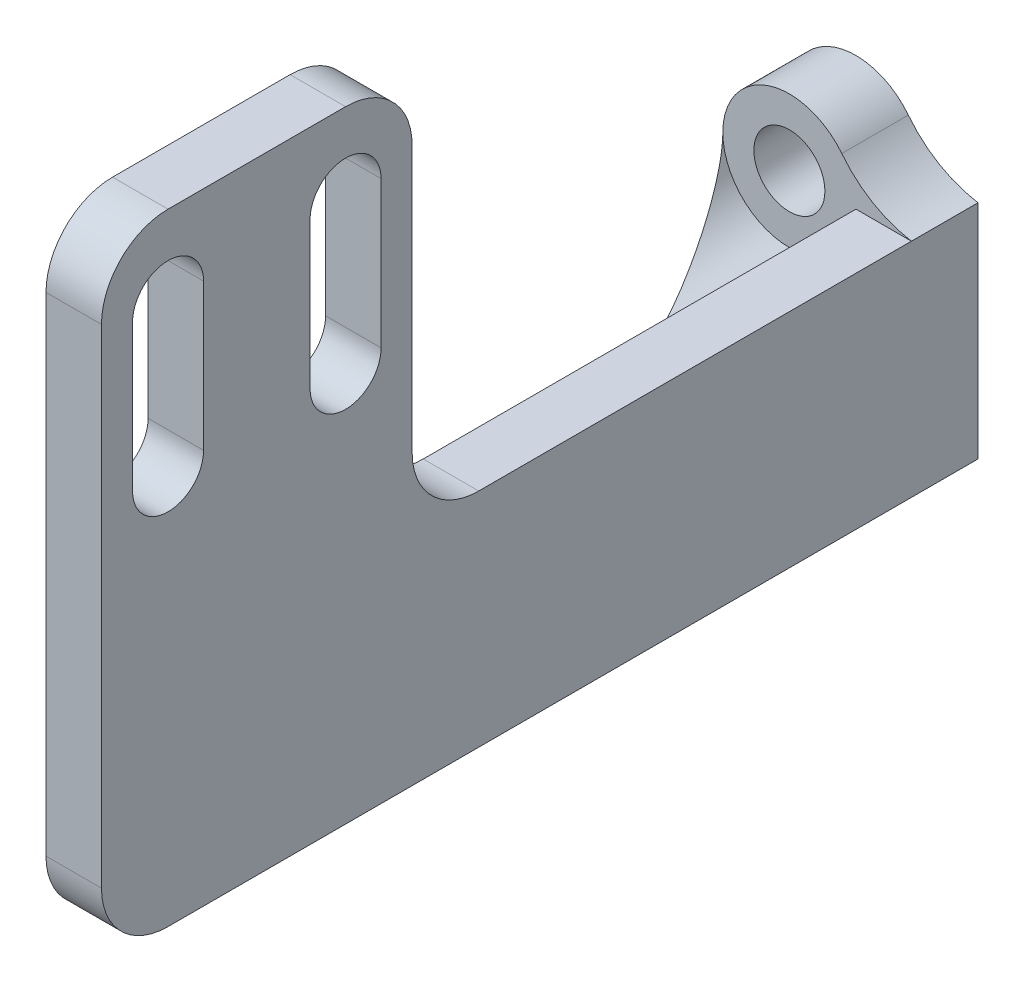
ISO-10303-21;
HEADER;
FILE_DESCRIPTION(('STEP AP214'),'2;1');
FILE_NAME('part.step','',(''),(''),'','','');
FILE_SCHEMA(('AUTOMOTIVE_DESIGN { 1 0 10303 214 1 1 1 1 }'));
ENDSEC;
DATA;
#1=APPLICATION_CONTEXT('core data for automotive mechanical design processes');
#2=APPLICATION_PROTOCOL_DEFINITION('international standard','automotive_design',2000,#1);
#3=PRODUCT_CONTEXT('',#1,'mechanical');
#4=PRODUCT('Part','Part','',(#3));
#5=PRODUCT_RELATED_PRODUCT_CATEGORY('part','',(#4));
#6=PRODUCT_DEFINITION_FORMATION('','',#4);
#7=PRODUCT_DEFINITION_CONTEXT('part definition',#1,'design');
#8=PRODUCT_DEFINITION('design','',#6,#7);
#9=PRODUCT_DEFINITION_SHAPE('','',#8);
#10=(LENGTH_UNIT() NAMED_UNIT(*) SI_UNIT(.MILLI.,.METRE.));
#11=(NAMED_UNIT(*) PLANE_ANGLE_UNIT() SI_UNIT($,.RADIAN.));
#12=(NAMED_UNIT(*) SI_UNIT($,.STERADIAN.) SOLID_ANGLE_UNIT());
#13=UNCERTAINTY_MEASURE_WITH_UNIT(LENGTH_MEASURE(1.E-05),#10,'distance_accuracy_value','');
#14=(GEOMETRIC_REPRESENTATION_CONTEXT(3) GLOBAL_UNCERTAINTY_ASSIGNED_CONTEXT((#13)) GLOBAL_UNIT_ASSIGNED_CONTEXT((#10,
#11,#12)) REPRESENTATION_CONTEXT('',''));
#15=CARTESIAN_POINT('',(0.,0.,0.));
#16=DIRECTION('',(0.,0.,1.));
#17=DIRECTION('',(1.,0.,0.));
#18=AXIS2_PLACEMENT_3D('',#15,#16,#17);
#19=CARTESIAN_POINT('',(3.00000000000005,-33.0103407456897,3.));
#20=DIRECTION('',(0.,1.,0.));
#21=DIRECTION('',(0.,0.,1.));
#22=AXIS2_PLACEMENT_3D('',#19,#20,#21);
#23=PLANE('',#22);
#24=DIRECTION('',(0.,0.,-1.));
#25=VECTOR('',#24,1.);
#26=CARTESIAN_POINT('',(3.00000000000005,-33.0103407456897,39.5));
#27=LINE('',#26,#25);
#28=CARTESIAN_POINT('',(3.00000000000005,-33.0103407456897,22.5));
#29=VERTEX_POINT('',#28);
#30=CARTESIAN_POINT('',(3.00000000000004,-33.0103407456897,14.));
#31=VERTEX_POINT('',#30);
#32=EDGE_CURVE('E345',#29,#31,#27,.T.);
#33=ORIENTED_EDGE('',*,*,#32,.F.);
#34=DIRECTION('',(1.,0.,0.));
#35=VECTOR('',#34,1.);
#36=CARTESIAN_POINT('',(5.50000000000005,-33.0103407456897,22.5));
#37=LINE('',#36,#35);
#38=CARTESIAN_POINT('',(5.50000000000005,-33.0103407456897,22.5));
#39=VERTEX_POINT('',#38);
#40=EDGE_CURVE('E313',#29,#39,#37,.T.);
#41=ORIENTED_EDGE('',*,*,#40,.T.);
#42=DIRECTION('',(0.,0.,-1.));
#43=VECTOR('',#42,1.);
#44=CARTESIAN_POINT('',(5.50000000000005,-33.0103407456897,3.));
#45=LINE('',#44,#43);
#46=CARTESIAN_POINT('',(5.50000000000005,-33.0103407456897,3.));
#47=VERTEX_POINT('',#46);
#48=EDGE_CURVE('E255',#39,#47,#45,.T.);
#49=ORIENTED_EDGE('',*,*,#48,.T.);
#50=DIRECTION('',(-1.,0.,0.));
#51=VECTOR('',#50,1.);
#52=CARTESIAN_POINT('',(0.,-33.0103407456897,3.));
#53=LINE('',#52,#51);
#54=CARTESIAN_POINT('',(3.00000000000004,-33.0103407456897,3.));
#55=VERTEX_POINT('',#54);
#56=EDGE_CURVE('E247',#47,#55,#53,.T.);
#57=ORIENTED_EDGE('',*,*,#56,.T.);
#58=DIRECTION('',(0.,0.,-1.));
#59=VECTOR('',#58,1.);
#60=CARTESIAN_POINT('',(3.00000000000004,-33.0103407456897,39.5));
#61=LINE('',#60,#59);
#62=EDGE_CURVE('E229',#55,#31,#61,.F.);
#63=ORIENTED_EDGE('',*,*,#62,.T.);
#64=EDGE_LOOP('',(#33,#41,#49,#57,#63));
#65=FACE_BOUND('',#64,.T.);
#66=ADVANCED_FACE('F67',(#65),#23,.T.);
#67=CARTESIAN_POINT('',(5.50000000000005,-43.0103407456897,3.));
#68=DIRECTION('',(0.,-1.,0.));
#69=DIRECTION('',(0.,0.,-1.));
#70=AXIS2_PLACEMENT_3D('',#67,#68,#69);
#71=PLANE('',#70);
#72=DIRECTION('',(0.,0.,-1.));
#73=VECTOR('',#72,1.);
#74=CARTESIAN_POINT('',(5.50000000000005,-43.0103407456897,3.));
#75=LINE('',#74,#73);
#76=CARTESIAN_POINT('',(5.50000000000005,-43.0103407456897,36.5));
#77=VERTEX_POINT('',#76);
#78=CARTESIAN_POINT('',(5.50000000000005,-43.0103407456897,3.));
#79=VERTEX_POINT('',#78);
#80=EDGE_CURVE('E396',#77,#79,#75,.T.);
#81=ORIENTED_EDGE('',*,*,#80,.F.);
#82=DIRECTION('',(1.,0.,0.));
#83=VECTOR('',#82,1.);
#84=CARTESIAN_POINT('',(5.50000000000005,-43.0103407456897,36.5));
#85=LINE('',#84,#83);
#86=CARTESIAN_POINT('',(3.00000000000005,-43.0103407456897,36.5));
#87=VERTEX_POINT('',#86);
#88=EDGE_CURVE('E306',#77,#87,#85,.F.);
#89=ORIENTED_EDGE('',*,*,#88,.T.);
#90=DIRECTION('',(0.,0.,-1.));
#91=VECTOR('',#90,1.);
#92=CARTESIAN_POINT('',(3.00000000000005,-43.0103407456897,39.5));
#93=LINE('',#92,#91);
#94=CARTESIAN_POINT('',(3.00000000000005,-43.0103407456897,14.));
#95=VERTEX_POINT('',#94);
#96=EDGE_CURVE('E347',#87,#95,#93,.T.);
#97=ORIENTED_EDGE('',*,*,#96,.T.);
#98=DIRECTION('',(0.,0.,-1.));
#99=VECTOR('',#98,1.);
#100=CARTESIAN_POINT('',(3.00000000000005,-43.0103407456897,39.5));
#101=LINE('',#100,#99);
#102=CARTESIAN_POINT('',(3.00000000000005,-43.0103407456897,3.));
#103=VERTEX_POINT('',#102);
#104=EDGE_CURVE('E239',#95,#103,#101,.T.);
#105=ORIENTED_EDGE('',*,*,#104,.T.);
#106=DIRECTION('',(1.,0.,0.));
#107=VECTOR('',#106,1.);
#108=CARTESIAN_POINT('',(0.,-43.0103407456897,3.));
#109=LINE('',#108,#107);
#110=EDGE_CURVE('E390',#103,#79,#109,.T.);
#111=ORIENTED_EDGE('',*,*,#110,.T.);
#112=EDGE_LOOP('',(#81,#89,#97,#105,#111));
#113=FACE_BOUND('',#112,.T.);
#114=ADVANCED_FACE('F451',(#113),#71,.T.);
#115=CARTESIAN_POINT('',(3.00000000000005,-20.480376659548,14.));
#116=DIRECTION('',(-0.877895572914384,0.,0.478852130680573));
#117=DIRECTION('',(0.478852130680573,0.,0.877895572914384));
#118=AXIS2_PLACEMENT_3D('',#115,#116,#117);
#119=PLANE('',#118);
#120=DIRECTION('',(0.,-1.,0.));
#121=VECTOR('',#120,1.);
#122=CARTESIAN_POINT('',(-2.99999999999995,0.,3.));
#123=LINE('',#122,#121);
#124=CARTESIAN_POINT('',(-2.99999999999995,-33.0103407456897,3.));
#125=VERTEX_POINT('',#124);
#126=CARTESIAN_POINT('',(-2.99999999999995,-43.0103407456897,3.));
#127=VERTEX_POINT('',#126);
#128=EDGE_CURVE('E357',#125,#127,#123,.T.);
#129=ORIENTED_EDGE('',*,*,#128,.T.);
#130=CARTESIAN_POINT('',(0.,-43.0103407456897,8.5));
#131=DIRECTION('',(-0.877895572914384,0.,0.478852130680573));
#132=DIRECTION('',(-0.478852130680573,0.,-0.877895572914384));
#133=AXIS2_PLACEMENT_3D('',#130,#131,#132);
#134=ELLIPSE('',#133,6.26498204307084,3.);
#135=EDGE_CURVE('E292',#127,#95,#134,.F.);
#136=ORIENTED_EDGE('',*,*,#135,.T.);
#137=DIRECTION('',(0.,-1.,0.));
#138=VECTOR('',#137,1.);
#139=CARTESIAN_POINT('',(3.00000000000005,-20.480376659548,14.));
#140=LINE('',#139,#138);
#141=EDGE_CURVE('E497',#31,#95,#140,.T.);
#142=ORIENTED_EDGE('',*,*,#141,.F.);
#143=CARTESIAN_POINT('',(0.,-33.0103407456897,8.5));
#144=DIRECTION('',(-0.877895572914384,0.,0.478852130680573));
#145=DIRECTION('',(-0.478852130680573,0.,-0.877895572914384));
#146=AXIS2_PLACEMENT_3D('',#143,#144,#145);
#147=ELLIPSE('',#146,6.26498204307082,2.99999999999999);
#148=EDGE_CURVE('E234',#31,#125,#147,.F.);
#149=ORIENTED_EDGE('',*,*,#148,.T.);
#150=EDGE_LOOP('',(#129,#136,#142,#149));
#151=FACE_BOUND('',#150,.T.);
#152=ADVANCED_FACE('F435',(#151),#119,.T.);
#153=CARTESIAN_POINT('',(0.,0.,3.));
#154=DIRECTION('',(0.,0.,1.));
#155=DIRECTION('',(1.,0.,0.));
#156=AXIS2_PLACEMENT_3D('',#153,#154,#155);
#157=PLANE('',#156);
#158=CARTESIAN_POINT('',(0.,-43.0103407456897,3.));
#159=DIRECTION('',(0.,0.,1.));
#160=DIRECTION('',(1.,0.,0.));
#161=AXIS2_PLACEMENT_3D('',#158,#159,#160);
#162=CIRCLE('',#161,3.);
#163=CARTESIAN_POINT('',(2.3607954545455,-44.8614606288408,3.));
#164=VERTEX_POINT('',#163);
#165=EDGE_CURVE('E360',#127,#164,#162,.T.);
#166=ORIENTED_EDGE('',*,*,#165,.T.);
#167=CARTESIAN_POINT('',(6.29545454545459,-47.9466604340928,3.));
#168=DIRECTION('',(0.,0.,1.));
#169=DIRECTION('',(1.,0.,0.));
#170=AXIS2_PLACEMENT_3D('',#167,#168,#169);
#171=CIRCLE('',#170,5.);
#172=EDGE_CURVE('E262',#164,#79,#171,.F.);
#173=ORIENTED_EDGE('',*,*,#172,.T.);
#174=ORIENTED_EDGE('',*,*,#110,.F.);
#175=CARTESIAN_POINT('',(0.,-43.0103407456897,3.));
#176=DIRECTION('',(0.,0.,1.));
#177=DIRECTION('',(1.,0.,0.));
#178=AXIS2_PLACEMENT_3D('',#175,#176,#177);
#179=CIRCLE('',#178,3.);
#180=EDGE_CURVE('E240',#103,#127,#179,.T.);
#181=ORIENTED_EDGE('',*,*,#180,.T.);
#182=EDGE_LOOP('',(#166,#173,#174,#181));
#183=FACE_BOUND('',#182,.T.);
#184=CARTESIAN_POINT('',(0.,-43.0103407456897,3.));
#185=DIRECTION('',(0.,0.,1.));
#186=DIRECTION('',(1.,0.,0.));
#187=AXIS2_PLACEMENT_3D('',#184,#185,#186);
#188=CIRCLE('',#187,1.6);
#189=CARTESIAN_POINT('',(1.60000000000005,-43.0103407456897,3.));
#190=VERTEX_POINT('',#189);
#191=EDGE_CURVE('E368',#190,#190,#188,.T.);
#192=ORIENTED_EDGE('',*,*,#191,.F.);
#193=EDGE_LOOP('',(#192));
#194=FACE_BOUND('',#193,.T.);
#195=ADVANCED_FACE('F408',(#183,#194),#157,.T.);
#196=CARTESIAN_POINT('',(0.,-43.0103407456897,3.));
#197=DIRECTION('',(0.,0.,-1.));
#198=DIRECTION('',(-1.,0.,0.));
#199=AXIS2_PLACEMENT_3D('',#196,#197,#198);
#200=CYLINDRICAL_SURFACE('',#199,1.6);
#201=ORIENTED_EDGE('',*,*,#191,.T.);
#202=EDGE_LOOP('',(#201));
#203=FACE_BOUND('',#202,.T.);
#204=CARTESIAN_POINT('',(0.,-43.0103407456897,0.));
#205=DIRECTION('',(0.,0.,1.));
#206=DIRECTION('',(1.,0.,0.));
#207=AXIS2_PLACEMENT_3D('',#204,#205,#206);
#208=CIRCLE('',#207,1.6);
#209=CARTESIAN_POINT('',(1.60000000000005,-43.0103407456897,0.));
#210=VERTEX_POINT('',#209);
#211=EDGE_CURVE('E361',#210,#210,#208,.T.);
#212=ORIENTED_EDGE('',*,*,#211,.F.);
#213=EDGE_LOOP('',(#212));
#214=FACE_BOUND('',#213,.T.);
#215=ADVANCED_FACE('F446',(#203,#214),#200,.F.);
#216=CARTESIAN_POINT('',(0.,-33.0103407456897,3.));
#217=DIRECTION('',(0.,0.,-1.));
#218=DIRECTION('',(-1.,0.,0.));
#219=AXIS2_PLACEMENT_3D('',#216,#217,#218);
#220=CYLINDRICAL_SURFACE('',#219,1.6);
#221=CARTESIAN_POINT('',(0.,-33.0103407456897,3.));
#222=DIRECTION('',(0.,0.,1.));
#223=DIRECTION('',(1.,0.,0.));
#224=AXIS2_PLACEMENT_3D('',#221,#222,#223);
#225=CIRCLE('',#224,1.6);
#226=CARTESIAN_POINT('',(1.60000000000005,-33.0103407456897,3.));
#227=VERTEX_POINT('',#226);
#228=EDGE_CURVE('E365',#227,#227,#225,.T.);
#229=ORIENTED_EDGE('',*,*,#228,.T.);
#230=EDGE_LOOP('',(#229));
#231=FACE_BOUND('',#230,.T.);
#232=CARTESIAN_POINT('',(0.,-33.0103407456897,0.));
#233=DIRECTION('',(0.,0.,1.));
#234=DIRECTION('',(1.,0.,0.));
#235=AXIS2_PLACEMENT_3D('',#232,#233,#234);
#236=CIRCLE('',#235,1.6);
#237=CARTESIAN_POINT('',(1.60000000000005,-33.0103407456897,0.));
#238=VERTEX_POINT('',#237);
#239=EDGE_CURVE('E380',#238,#238,#236,.T.);
#240=ORIENTED_EDGE('',*,*,#239,.F.);
#241=EDGE_LOOP('',(#240));
#242=FACE_BOUND('',#241,.T.);
#243=ADVANCED_FACE('F439',(#231,#242),#220,.F.);
#244=CARTESIAN_POINT('',(0.,-43.0103407456897,3.));
#245=DIRECTION('',(0.,0.,-1.));
#246=DIRECTION('',(-1.,0.,0.));
#247=AXIS2_PLACEMENT_3D('',#244,#245,#246);
#248=CYLINDRICAL_SURFACE('',#247,3.);
#249=CARTESIAN_POINT('',(0.,-43.0103407456897,0.));
#250=DIRECTION('',(0.,0.,1.));
#251=DIRECTION('',(1.,0.,0.));
#252=AXIS2_PLACEMENT_3D('',#249,#250,#251);
#253=CIRCLE('',#252,3.);
#254=CARTESIAN_POINT('',(-2.99999999999995,-43.0103407456897,0.));
#255=VERTEX_POINT('',#254);
#256=CARTESIAN_POINT('',(2.3607954545455,-44.8614606288408,0.));
#257=VERTEX_POINT('',#256);
#258=EDGE_CURVE('E375',#255,#257,#253,.T.);
#259=ORIENTED_EDGE('',*,*,#258,.T.);
#260=DIRECTION('',(0.,0.,-1.));
#261=VECTOR('',#260,1.);
#262=CARTESIAN_POINT('',(2.3607954545455,-44.8614606288408,3.));
#263=LINE('',#262,#261);
#264=EDGE_CURVE('E400',#257,#164,#263,.F.);
#265=ORIENTED_EDGE('',*,*,#264,.T.);
#266=ORIENTED_EDGE('',*,*,#165,.F.);
#267=DIRECTION('',(0.,0.,-1.));
#268=VECTOR('',#267,1.);
#269=CARTESIAN_POINT('',(-2.99999999999995,-43.0103407456897,3.));
#270=LINE('',#269,#268);
#271=EDGE_CURVE('E387',#127,#255,#270,.T.);
#272=ORIENTED_EDGE('',*,*,#271,.T.);
#273=EDGE_LOOP('',(#259,#265,#266,#272));
#274=FACE_BOUND('',#273,.T.);
#275=ADVANCED_FACE('F437',(#274),#248,.T.);
#276=CARTESIAN_POINT('',(0.,-33.0103407456897,3.));
#277=DIRECTION('',(0.,0.,-1.));
#278=DIRECTION('',(-1.,0.,0.));
#279=AXIS2_PLACEMENT_3D('',#276,#277,#278);
#280=CYLINDRICAL_SURFACE('',#279,3.);
#281=CARTESIAN_POINT('',(0.,-33.0103407456897,3.));
#282=DIRECTION('',(0.,0.,1.));
#283=DIRECTION('',(1.,0.,0.));
#284=AXIS2_PLACEMENT_3D('',#281,#282,#283);
#285=CIRCLE('',#284,3.);
#286=CARTESIAN_POINT('',(2.3607954545455,-31.1592208625386,3.));
#287=VERTEX_POINT('',#286);
#288=EDGE_CURVE('E250',#287,#125,#285,.T.);
#289=ORIENTED_EDGE('',*,*,#288,.F.);
#290=DIRECTION('',(0.,0.,-1.));
#291=VECTOR('',#290,1.);
#292=CARTESIAN_POINT('',(2.3607954545455,-31.1592208625386,3.));
#293=LINE('',#292,#291);
#294=CARTESIAN_POINT('',(2.3607954545455,-31.1592208625386,0.));
#295=VERTEX_POINT('',#294);
#296=EDGE_CURVE('E257',#287,#295,#293,.T.);
#297=ORIENTED_EDGE('',*,*,#296,.T.);
#298=CARTESIAN_POINT('',(0.,-33.0103407456897,0.));
#299=DIRECTION('',(0.,0.,1.));
#300=DIRECTION('',(1.,0.,0.));
#301=AXIS2_PLACEMENT_3D('',#298,#299,#300);
#302=CIRCLE('',#301,3.);
#303=CARTESIAN_POINT('',(-2.99999999999995,-33.0103407456897,0.));
#304=VERTEX_POINT('',#303);
#305=EDGE_CURVE('E378',#295,#304,#302,.T.);
#306=ORIENTED_EDGE('',*,*,#305,.T.);
#307=DIRECTION('',(0.,0.,-1.));
#308=VECTOR('',#307,1.);
#309=CARTESIAN_POINT('',(-2.99999999999995,-33.0103407456897,3.));
#310=LINE('',#309,#308);
#311=EDGE_CURVE('E371',#125,#304,#310,.T.);
#312=ORIENTED_EDGE('',*,*,#311,.F.);
#313=EDGE_LOOP('',(#289,#297,#306,#312));
#314=FACE_BOUND('',#313,.T.);
#315=ADVANCED_FACE('F429',(#314),#280,.T.);
#316=CARTESIAN_POINT('',(-2.99999999999995,0.,3.));
#317=DIRECTION('',(1.,0.,0.));
#318=DIRECTION('',(0.,0.,-1.));
#319=AXIS2_PLACEMENT_3D('',#316,#317,#318);
#320=PLANE('',#319);
#321=DIRECTION('',(0.,-1.,0.));
#322=VECTOR('',#321,1.);
#323=CARTESIAN_POINT('',(-2.99999999999995,0.,0.));
#324=LINE('',#323,#322);
#325=EDGE_CURVE('E372',#304,#255,#324,.T.);
#326=ORIENTED_EDGE('',*,*,#325,.T.);
#327=ORIENTED_EDGE('',*,*,#271,.F.);
#328=ORIENTED_EDGE('',*,*,#128,.F.);
#329=ORIENTED_EDGE('',*,*,#311,.T.);
#330=EDGE_LOOP('',(#326,#327,#328,#329));
#331=FACE_BOUND('',#330,.T.);
#332=ADVANCED_FACE('F433',(#331),#320,.F.);
#333=CARTESIAN_POINT('',(0.,0.,0.));
#334=DIRECTION('',(0.,0.,1.));
#335=DIRECTION('',(1.,0.,0.));
#336=AXIS2_PLACEMENT_3D('',#333,#334,#335);
#337=PLANE('',#336);
#338=ORIENTED_EDGE('',*,*,#325,.F.);
#339=ORIENTED_EDGE('',*,*,#305,.F.);
#340=CARTESIAN_POINT('',(6.29545454545459,-28.0740210572866,0.));
#341=DIRECTION('',(0.,0.,1.));
#342=DIRECTION('',(1.,0.,0.));
#343=AXIS2_PLACEMENT_3D('',#340,#341,#342);
#344=CIRCLE('',#343,5.);
#345=CARTESIAN_POINT('',(5.50000000000005,-33.0103407456897,0.));
#346=VERTEX_POINT('',#345);
#347=EDGE_CURVE('E256',#295,#346,#344,.T.);
#348=ORIENTED_EDGE('',*,*,#347,.T.);
#349=DIRECTION('',(0.,-1.,0.));
#350=VECTOR('',#349,1.);
#351=CARTESIAN_POINT('',(5.50000000000005,-33.0103407456897,0.));
#352=LINE('',#351,#350);
#353=CARTESIAN_POINT('',(5.50000000000005,-43.0103407456897,0.));
#354=VERTEX_POINT('',#353);
#355=EDGE_CURVE('E350',#346,#354,#352,.T.);
#356=ORIENTED_EDGE('',*,*,#355,.T.);
#357=CARTESIAN_POINT('',(6.29545454545459,-47.9466604340928,0.));
#358=DIRECTION('',(0.,0.,1.));
#359=DIRECTION('',(1.,0.,0.));
#360=AXIS2_PLACEMENT_3D('',#357,#358,#359);
#361=CIRCLE('',#360,5.);
#362=EDGE_CURVE('E402',#354,#257,#361,.T.);
#363=ORIENTED_EDGE('',*,*,#362,.T.);
#364=ORIENTED_EDGE('',*,*,#258,.F.);
#365=EDGE_LOOP('',(#338,#339,#348,#356,#363,#364));
#366=FACE_BOUND('',#365,.T.);
#367=ORIENTED_EDGE('',*,*,#239,.T.);
#368=EDGE_LOOP('',(#367));
#369=FACE_BOUND('',#368,.T.);
#370=ORIENTED_EDGE('',*,*,#211,.T.);
#371=EDGE_LOOP('',(#370));
#372=FACE_BOUND('',#371,.T.);
#373=ADVANCED_FACE('F421',(#366,#369,#372),#337,.F.);
#374=CARTESIAN_POINT('',(6.29545454545459,-28.0740210572866,3.));
#375=DIRECTION('',(0.,0.,1.));
#376=DIRECTION('',(1.,0.,0.));
#377=AXIS2_PLACEMENT_3D('',#374,#375,#376);
#378=CIRCLE('',#377,5.);
#379=EDGE_CURVE('E259',#47,#287,#378,.F.);
#380=ORIENTED_EDGE('',*,*,#379,.T.);
#381=ORIENTED_EDGE('',*,*,#288,.T.);
#382=CARTESIAN_POINT('',(0.,-33.0103407456897,3.));
#383=DIRECTION('',(0.,0.,1.));
#384=DIRECTION('',(1.,0.,0.));
#385=AXIS2_PLACEMENT_3D('',#382,#383,#384);
#386=CIRCLE('',#385,2.99999999999999);
#387=EDGE_CURVE('E232',#125,#55,#386,.T.);
#388=ORIENTED_EDGE('',*,*,#387,.T.);
#389=ORIENTED_EDGE('',*,*,#56,.F.);
#390=EDGE_LOOP('',(#380,#381,#388,#389));
#391=FACE_BOUND('',#390,.T.);
#392=ORIENTED_EDGE('',*,*,#228,.F.);
#393=EDGE_LOOP('',(#392));
#394=FACE_BOUND('',#393,.T.);
#395=ADVANCED_FACE('F245',(#391,#394),#157,.T.);
#396=CARTESIAN_POINT('',(5.50000000000005,-33.0103407456897,3.));
#397=DIRECTION('',(1.,0.,0.));
#398=DIRECTION('',(0.,0.,-1.));
#399=AXIS2_PLACEMENT_3D('',#396,#397,#398);
#400=PLANE('',#399);
#401=CARTESIAN_POINT('',(5.50000000000005,-18.6179185229941,36.5000000000008));
#402=DIRECTION('',(1.,0.,0.));
#403=DIRECTION('',(0.,0.,-1.));
#404=AXIS2_PLACEMENT_3D('',#401,#402,#403);
#405=CIRCLE('',#404,1.59999999999999);
#406=CARTESIAN_POINT('',(5.50000000000005,-18.6179185229941,34.9000000000008));
#407=VERTEX_POINT('',#406);
#408=CARTESIAN_POINT('',(5.50000000000005,-18.6179185229941,38.1000000000008));
#409=VERTEX_POINT('',#408);
#410=EDGE_CURVE('E502',#407,#409,#405,.T.);
#411=ORIENTED_EDGE('',*,*,#410,.F.);
#412=DIRECTION('',(0.,1.,0.));
#413=VECTOR('',#412,1.);
#414=CARTESIAN_POINT('',(5.50000000000005,-18.6179185229941,34.9000000000008));
#415=LINE('',#414,#413);
#416=CARTESIAN_POINT('',(5.50000000000005,-25.2232424042106,34.9000000000008));
#417=VERTEX_POINT('',#416);
#418=EDGE_CURVE('E511',#417,#407,#415,.T.);
#419=ORIENTED_EDGE('',*,*,#418,.F.);
#420=CARTESIAN_POINT('',(5.50000000000005,-25.2232424042106,36.5000000000008));
#421=DIRECTION('',(1.,0.,0.));
#422=DIRECTION('',(0.,0.,-1.));
#423=AXIS2_PLACEMENT_3D('',#420,#421,#422);
#424=CIRCLE('',#423,1.59999999999999);
#425=CARTESIAN_POINT('',(5.50000000000005,-25.2232424042106,38.1000000000008));
#426=VERTEX_POINT('',#425);
#427=EDGE_CURVE('E508',#426,#417,#424,.T.);
#428=ORIENTED_EDGE('',*,*,#427,.F.);
#429=DIRECTION('',(0.,-1.,0.));
#430=VECTOR('',#429,1.);
#431=CARTESIAN_POINT('',(5.50000000000005,-18.6179185229941,38.1000000000008));
#432=LINE('',#431,#430);
#433=EDGE_CURVE('E504',#409,#426,#432,.T.);
#434=ORIENTED_EDGE('',*,*,#433,.F.);
#435=EDGE_LOOP('',(#411,#419,#428,#434));
#436=FACE_BOUND('',#435,.T.);
#437=CARTESIAN_POINT('',(5.50000000000005,-18.6179185229941,28.5000000000008));
#438=DIRECTION('',(1.,0.,0.));
#439=DIRECTION('',(0.,0.,1.));
#440=AXIS2_PLACEMENT_3D('',#437,#438,#439);
#441=CIRCLE('',#440,1.6);
#442=CARTESIAN_POINT('',(5.50000000000005,-18.6179185229941,26.9000000000008));
#443=VERTEX_POINT('',#442);
#444=CARTESIAN_POINT('',(5.50000000000005,-18.6179185229941,30.1000000000008));
#445=VERTEX_POINT('',#444);
#446=EDGE_CURVE('E505',#443,#445,#441,.T.);
#447=ORIENTED_EDGE('',*,*,#446,.F.);
#448=DIRECTION('',(0.,1.,0.));
#449=VECTOR('',#448,1.);
#450=CARTESIAN_POINT('',(5.50000000000005,-18.6179185229941,26.9000000000008));
#451=LINE('',#450,#449);
#452=CARTESIAN_POINT('',(5.50000000000005,-25.2232424042106,26.9000000000008));
#453=VERTEX_POINT('',#452);
#454=EDGE_CURVE('E525',#453,#443,#451,.T.);
#455=ORIENTED_EDGE('',*,*,#454,.F.);
#456=CARTESIAN_POINT('',(5.50000000000005,-25.2232424042106,28.5000000000008));
#457=DIRECTION('',(1.,0.,0.));
#458=DIRECTION('',(0.,0.,1.));
#459=AXIS2_PLACEMENT_3D('',#456,#457,#458);
#460=CIRCLE('',#459,1.6);
#461=CARTESIAN_POINT('',(5.50000000000005,-25.2232424042106,30.1000000000008));
#462=VERTEX_POINT('',#461);
#463=EDGE_CURVE('E533',#462,#453,#460,.T.);
#464=ORIENTED_EDGE('',*,*,#463,.F.);
#465=DIRECTION('',(0.,-1.,0.));
#466=VECTOR('',#465,1.);
#467=CARTESIAN_POINT('',(5.50000000000005,-18.6179185229941,30.1000000000008));
#468=LINE('',#467,#466);
#469=EDGE_CURVE('E536',#445,#462,#468,.T.);
#470=ORIENTED_EDGE('',*,*,#469,.F.);
#471=EDGE_LOOP('',(#447,#455,#464,#470));
#472=FACE_BOUND('',#471,.T.);
#473=DIRECTION('',(0.,1.,0.));
#474=VECTOR('',#473,1.);
#475=CARTESIAN_POINT('',(5.50000000000005,-43.0103407456897,39.5));
#476=LINE('',#475,#474);
#477=CARTESIAN_POINT('',(5.50000000000005,-40.0103407456897,39.5));
#478=VERTEX_POINT('',#477);
#479=CARTESIAN_POINT('',(5.50000000000005,-18.0103407456897,39.5));
#480=VERTEX_POINT('',#479);
#481=EDGE_CURVE('E348',#478,#480,#476,.T.);
#482=ORIENTED_EDGE('',*,*,#481,.F.);
#483=CARTESIAN_POINT('',(5.50000000000005,-40.0103407456897,36.5));
#484=DIRECTION('',(1.,0.,0.));
#485=DIRECTION('',(0.,0.,-1.));
#486=AXIS2_PLACEMENT_3D('',#483,#484,#485);
#487=CIRCLE('',#486,3.);
#488=EDGE_CURVE('E304',#478,#77,#487,.T.);
#489=ORIENTED_EDGE('',*,*,#488,.T.);
#490=ORIENTED_EDGE('',*,*,#80,.T.);
#491=EDGE_CURVE('E393',#79,#354,#75,.T.);
#492=ORIENTED_EDGE('',*,*,#491,.T.);
#493=ORIENTED_EDGE('',*,*,#355,.F.);
#494=EDGE_CURVE('E395',#47,#346,#45,.T.);
#495=ORIENTED_EDGE('',*,*,#494,.F.);
#496=ORIENTED_EDGE('',*,*,#48,.F.);
#497=CARTESIAN_POINT('',(5.50000000000005,-30.0103407456897,22.5));
#498=DIRECTION('',(1.,0.,0.));
#499=DIRECTION('',(0.,0.,-1.));
#500=AXIS2_PLACEMENT_3D('',#497,#498,#499);
#501=CIRCLE('',#500,3.);
#502=CARTESIAN_POINT('',(5.50000000000005,-30.0103407456897,25.5));
#503=VERTEX_POINT('',#502);
#504=EDGE_CURVE('E75',#39,#503,#501,.F.);
#505=ORIENTED_EDGE('',*,*,#504,.T.);
#506=DIRECTION('',(0.,1.,0.));
#507=VECTOR('',#506,1.);
#508=CARTESIAN_POINT('',(5.50000000000005,-15.0103407456897,25.5));
#509=LINE('',#508,#507);
#510=CARTESIAN_POINT('',(5.50000000000005,-18.0103407456897,25.5));
#511=VERTEX_POINT('',#510);
#512=EDGE_CURVE('E328',#503,#511,#509,.T.);
#513=ORIENTED_EDGE('',*,*,#512,.T.);
#514=CARTESIAN_POINT('',(5.50000000000005,-18.0103407456897,28.5));
#515=DIRECTION('',(1.,0.,0.));
#516=DIRECTION('',(0.,0.,-1.));
#517=AXIS2_PLACEMENT_3D('',#514,#515,#516);
#518=CIRCLE('',#517,3.);
#519=CARTESIAN_POINT('',(5.50000000000005,-15.0103407456897,28.5));
#520=VERTEX_POINT('',#519);
#521=EDGE_CURVE('E300',#511,#520,#518,.T.);
#522=ORIENTED_EDGE('',*,*,#521,.T.);
#523=DIRECTION('',(0.,0.,1.));
#524=VECTOR('',#523,1.);
#525=CARTESIAN_POINT('',(5.50000000000005,-15.0103407456897,39.5));
#526=LINE('',#525,#524);
#527=CARTESIAN_POINT('',(5.50000000000005,-15.0103407456897,36.5));
#528=VERTEX_POINT('',#527);
#529=EDGE_CURVE('E337',#520,#528,#526,.T.);
#530=ORIENTED_EDGE('',*,*,#529,.T.);
#531=CARTESIAN_POINT('',(5.50000000000005,-18.0103407456897,36.5));
#532=DIRECTION('',(1.,0.,0.));
#533=DIRECTION('',(0.,0.,-1.));
#534=AXIS2_PLACEMENT_3D('',#531,#532,#533);
#535=CIRCLE('',#534,3.);
#536=EDGE_CURVE('E302',#528,#480,#535,.T.);
#537=ORIENTED_EDGE('',*,*,#536,.T.);
#538=EDGE_LOOP('',(#482,#489,#490,#492,#493,#495,#496,#505,#513,#522,#530,#537));
#539=FACE_BOUND('',#538,.T.);
#540=ADVANCED_FACE('F327',(#436,#472,#539),#400,.T.);
#541=CARTESIAN_POINT('',(3.00000000000005,-33.0103407456897,39.5));
#542=DIRECTION('',(1.,0.,0.));
#543=DIRECTION('',(0.,0.,-1.));
#544=AXIS2_PLACEMENT_3D('',#541,#542,#543);
#545=PLANE('',#544);
#546=DIRECTION('',(0.,1.,0.));
#547=VECTOR('',#546,1.);
#548=CARTESIAN_POINT('',(3.00000000000005,-33.0103407456897,34.9000000000008));
#549=LINE('',#548,#547);
#550=CARTESIAN_POINT('',(3.00000000000005,-25.2232424042106,34.9000000000008));
#551=VERTEX_POINT('',#550);
#552=CARTESIAN_POINT('',(3.00000000000005,-18.6179185229941,34.9000000000008));
#553=VERTEX_POINT('',#552);
#554=EDGE_CURVE('E285',#551,#553,#549,.T.);
#555=ORIENTED_EDGE('',*,*,#554,.T.);
#556=CARTESIAN_POINT('',(3.00000000000005,-18.6179185229941,36.5000000000008));
#557=DIRECTION('',(1.,0.,0.));
#558=DIRECTION('',(0.,0.,-1.));
#559=AXIS2_PLACEMENT_3D('',#556,#557,#558);
#560=CIRCLE('',#559,1.59999999999999);
#561=CARTESIAN_POINT('',(3.00000000000005,-18.6179185229941,38.1000000000008));
#562=VERTEX_POINT('',#561);
#563=EDGE_CURVE('E288',#553,#562,#560,.T.);
#564=ORIENTED_EDGE('',*,*,#563,.T.);
#565=DIRECTION('',(0.,-1.,0.));
#566=VECTOR('',#565,1.);
#567=CARTESIAN_POINT('',(3.00000000000005,-33.0103407456897,38.1000000000008));
#568=LINE('',#567,#566);
#569=CARTESIAN_POINT('',(3.00000000000005,-25.2232424042106,38.1000000000008));
#570=VERTEX_POINT('',#569);
#571=EDGE_CURVE('E279',#562,#570,#568,.T.);
#572=ORIENTED_EDGE('',*,*,#571,.T.);
#573=CARTESIAN_POINT('',(3.00000000000005,-25.2232424042106,36.5000000000008));
#574=DIRECTION('',(1.,0.,0.));
#575=DIRECTION('',(0.,0.,-1.));
#576=AXIS2_PLACEMENT_3D('',#573,#574,#575);
#577=CIRCLE('',#576,1.59999999999999);
#578=EDGE_CURVE('E282',#570,#551,#577,.T.);
#579=ORIENTED_EDGE('',*,*,#578,.T.);
#580=EDGE_LOOP('',(#555,#564,#572,#579));
#581=FACE_BOUND('',#580,.T.);
#582=DIRECTION('',(0.,1.,0.));
#583=VECTOR('',#582,1.);
#584=CARTESIAN_POINT('',(3.00000000000005,-33.0103407456897,26.9000000000008));
#585=LINE('',#584,#583);
#586=CARTESIAN_POINT('',(3.00000000000005,-25.2232424042106,26.9000000000008));
#587=VERTEX_POINT('',#586);
#588=CARTESIAN_POINT('',(3.00000000000005,-18.6179185229941,26.9000000000008));
#589=VERTEX_POINT('',#588);
#590=EDGE_CURVE('E273',#587,#589,#585,.T.);
#591=ORIENTED_EDGE('',*,*,#590,.T.);
#592=CARTESIAN_POINT('',(3.00000000000005,-18.6179185229941,28.5000000000008));
#593=DIRECTION('',(1.,0.,0.));
#594=DIRECTION('',(0.,0.,-1.));
#595=AXIS2_PLACEMENT_3D('',#592,#593,#594);
#596=CIRCLE('',#595,1.6);
#597=CARTESIAN_POINT('',(3.00000000000005,-18.6179185229941,30.1000000000008));
#598=VERTEX_POINT('',#597);
#599=EDGE_CURVE('E276',#589,#598,#596,.T.);
#600=ORIENTED_EDGE('',*,*,#599,.T.);
#601=DIRECTION('',(0.,-1.,0.));
#602=VECTOR('',#601,1.);
#603=CARTESIAN_POINT('',(3.00000000000005,-33.0103407456897,30.1000000000008));
#604=LINE('',#603,#602);
#605=CARTESIAN_POINT('',(3.00000000000005,-25.2232424042106,30.1000000000008));
#606=VERTEX_POINT('',#605);
#607=EDGE_CURVE('E267',#598,#606,#604,.T.);
#608=ORIENTED_EDGE('',*,*,#607,.T.);
#609=CARTESIAN_POINT('',(3.00000000000005,-25.2232424042106,28.5000000000008));
#610=DIRECTION('',(1.,0.,0.));
#611=DIRECTION('',(0.,0.,-1.));
#612=AXIS2_PLACEMENT_3D('',#609,#610,#611);
#613=CIRCLE('',#612,1.6);
#614=EDGE_CURVE('E270',#606,#587,#613,.T.);
#615=ORIENTED_EDGE('',*,*,#614,.T.);
#616=EDGE_LOOP('',(#591,#600,#608,#615));
#617=FACE_BOUND('',#616,.T.);
#618=ORIENTED_EDGE('',*,*,#96,.F.);
#619=CARTESIAN_POINT('',(3.00000000000005,-40.0103407456897,36.5));
#620=DIRECTION('',(1.,0.,0.));
#621=DIRECTION('',(0.,0.,-1.));
#622=AXIS2_PLACEMENT_3D('',#619,#620,#621);
#623=CIRCLE('',#622,3.);
#624=CARTESIAN_POINT('',(3.00000000000005,-40.0103407456897,39.5));
#625=VERTEX_POINT('',#624);
#626=EDGE_CURVE('E311',#87,#625,#623,.F.);
#627=ORIENTED_EDGE('',*,*,#626,.T.);
#628=DIRECTION('',(0.,-1.,0.));
#629=VECTOR('',#628,1.);
#630=CARTESIAN_POINT('',(3.00000000000005,-33.0103407456897,39.5));
#631=LINE('',#630,#629);
#632=CARTESIAN_POINT('',(3.00000000000005,-18.0103407456897,39.5));
#633=VERTEX_POINT('',#632);
#634=EDGE_CURVE('E353',#633,#625,#631,.T.);
#635=ORIENTED_EDGE('',*,*,#634,.F.);
#636=CARTESIAN_POINT('',(3.00000000000005,-18.0103407456897,36.5));
#637=DIRECTION('',(1.,0.,0.));
#638=DIRECTION('',(0.,0.,-1.));
#639=AXIS2_PLACEMENT_3D('',#636,#637,#638);
#640=CIRCLE('',#639,3.);
#641=CARTESIAN_POINT('',(3.00000000000005,-15.0103407456897,36.5));
#642=VERTEX_POINT('',#641);
#643=EDGE_CURVE('E89',#633,#642,#640,.F.);
#644=ORIENTED_EDGE('',*,*,#643,.T.);
#645=DIRECTION('',(0.,0.,-1.));
#646=VECTOR('',#645,1.);
#647=CARTESIAN_POINT('',(3.00000000000005,-15.0103407456897,39.5));
#648=LINE('',#647,#646);
#649=CARTESIAN_POINT('',(3.00000000000005,-15.0103407456897,28.5));
#650=VERTEX_POINT('',#649);
#651=EDGE_CURVE('E485',#642,#650,#648,.T.);
#652=ORIENTED_EDGE('',*,*,#651,.T.);
#653=CARTESIAN_POINT('',(3.00000000000005,-18.0103407456897,28.5));
#654=DIRECTION('',(1.,0.,0.));
#655=DIRECTION('',(0.,0.,-1.));
#656=AXIS2_PLACEMENT_3D('',#653,#654,#655);
#657=CIRCLE('',#656,3.);
#658=CARTESIAN_POINT('',(3.00000000000005,-18.0103407456897,25.5));
#659=VERTEX_POINT('',#658);
#660=EDGE_CURVE('E308',#650,#659,#657,.F.);
#661=ORIENTED_EDGE('',*,*,#660,.T.);
#662=DIRECTION('',(0.,-1.,0.));
#663=VECTOR('',#662,1.);
#664=CARTESIAN_POINT('',(3.00000000000005,-15.0103407456897,25.5));
#665=LINE('',#664,#663);
#666=CARTESIAN_POINT('',(3.00000000000005,-30.0103407456897,25.5));
#667=VERTEX_POINT('',#666);
#668=EDGE_CURVE('E346',#659,#667,#665,.T.);
#669=ORIENTED_EDGE('',*,*,#668,.T.);
#670=CARTESIAN_POINT('',(3.00000000000005,-30.0103407456897,22.5));
#671=DIRECTION('',(1.,0.,0.));
#672=DIRECTION('',(0.,0.,-1.));
#673=AXIS2_PLACEMENT_3D('',#670,#671,#672);
#674=CIRCLE('',#673,3.);
#675=EDGE_CURVE('E12',#667,#29,#674,.T.);
#676=ORIENTED_EDGE('',*,*,#675,.T.);
#677=ORIENTED_EDGE('',*,*,#32,.T.);
#678=ORIENTED_EDGE('',*,*,#141,.T.);
#679=EDGE_LOOP('',(#618,#627,#635,#644,#652,#661,#669,#676,#677,#678));
#680=FACE_BOUND('',#679,.T.);
#681=ADVANCED_FACE('F343',(#581,#617,#680),#545,.F.);
#682=CARTESIAN_POINT('',(0.,0.,39.5));
#683=DIRECTION('',(0.,0.,1.));
#684=DIRECTION('',(1.,0.,0.));
#685=AXIS2_PLACEMENT_3D('',#682,#683,#684);
#686=PLANE('',#685);
#687=ORIENTED_EDGE('',*,*,#634,.T.);
#688=DIRECTION('',(1.,0.,0.));
#689=VECTOR('',#688,1.);
#690=CARTESIAN_POINT('',(0.,-40.0103407456897,39.5));
#691=LINE('',#690,#689);
#692=EDGE_CURVE('E297',#625,#478,#691,.T.);
#693=ORIENTED_EDGE('',*,*,#692,.T.);
#694=ORIENTED_EDGE('',*,*,#481,.T.);
#695=DIRECTION('',(1.,0.,0.));
#696=VECTOR('',#695,1.);
#697=CARTESIAN_POINT('',(0.,-18.0103407456897,39.5));
#698=LINE('',#697,#696);
#699=EDGE_CURVE('E295',#480,#633,#698,.F.);
#700=ORIENTED_EDGE('',*,*,#699,.T.);
#701=EDGE_LOOP('',(#687,#693,#694,#700));
#702=FACE_BOUND('',#701,.T.);
#703=ADVANCED_FACE('F465',(#702),#686,.T.);
#704=CARTESIAN_POINT('',(6.29545454545459,-47.9466604340928,3.));
#705=DIRECTION('',(0.,0.,1.));
#706=DIRECTION('',(1.,0.,0.));
#707=AXIS2_PLACEMENT_3D('',#704,#705,#706);
#708=CYLINDRICAL_SURFACE('',#707,5.);
#709=ORIENTED_EDGE('',*,*,#172,.F.);
#710=ORIENTED_EDGE('',*,*,#264,.F.);
#711=ORIENTED_EDGE('',*,*,#362,.F.);
#712=ORIENTED_EDGE('',*,*,#491,.F.);
#713=EDGE_LOOP('',(#709,#710,#711,#712));
#714=FACE_BOUND('',#713,.T.);
#715=ADVANCED_FACE('F415',(#714),#708,.F.);
#716=CARTESIAN_POINT('',(6.29545454545459,-28.0740210572866,3.));
#717=DIRECTION('',(0.,0.,1.));
#718=DIRECTION('',(1.,0.,0.));
#719=AXIS2_PLACEMENT_3D('',#716,#717,#718);
#720=CYLINDRICAL_SURFACE('',#719,5.);
#721=ORIENTED_EDGE('',*,*,#379,.F.);
#722=ORIENTED_EDGE('',*,*,#494,.T.);
#723=ORIENTED_EDGE('',*,*,#347,.F.);
#724=ORIENTED_EDGE('',*,*,#296,.F.);
#725=EDGE_LOOP('',(#721,#722,#723,#724));
#726=FACE_BOUND('',#725,.T.);
#727=ADVANCED_FACE('F427',(#726),#720,.F.);
#728=CARTESIAN_POINT('',(-19.8035085019827,-15.0103407456897,39.5));
#729=DIRECTION('',(0.,1.,0.));
#730=DIRECTION('',(0.,0.,1.));
#731=AXIS2_PLACEMENT_3D('',#728,#729,#730);
#732=PLANE('',#731);
#733=ORIENTED_EDGE('',*,*,#651,.F.);
#734=DIRECTION('',(1.,0.,0.));
#735=VECTOR('',#734,1.);
#736=CARTESIAN_POINT('',(-19.8035085019827,-15.0103407456897,36.5));
#737=LINE('',#736,#735);
#738=EDGE_CURVE('E321',#642,#528,#737,.T.);
#739=ORIENTED_EDGE('',*,*,#738,.T.);
#740=ORIENTED_EDGE('',*,*,#529,.F.);
#741=DIRECTION('',(1.,0.,0.));
#742=VECTOR('',#741,1.);
#743=CARTESIAN_POINT('',(-19.8035085019827,-15.0103407456897,28.5));
#744=LINE('',#743,#742);
#745=EDGE_CURVE('E82',#520,#650,#744,.F.);
#746=ORIENTED_EDGE('',*,*,#745,.T.);
#747=EDGE_LOOP('',(#733,#739,#740,#746));
#748=FACE_BOUND('',#747,.T.);
#749=ADVANCED_FACE('F468',(#748),#732,.T.);
#750=CARTESIAN_POINT('',(-19.8035085019827,-15.0103407456897,25.5));
#751=DIRECTION('',(0.,0.,-1.));
#752=DIRECTION('',(-1.,0.,0.));
#753=AXIS2_PLACEMENT_3D('',#750,#751,#752);
#754=PLANE('',#753);
#755=ORIENTED_EDGE('',*,*,#512,.F.);
#756=DIRECTION('',(1.,0.,0.));
#757=VECTOR('',#756,1.);
#758=CARTESIAN_POINT('',(3.00000000000005,-30.0103407456897,25.5));
#759=LINE('',#758,#757);
#760=EDGE_CURVE('E318',#503,#667,#759,.F.);
#761=ORIENTED_EDGE('',*,*,#760,.T.);
#762=ORIENTED_EDGE('',*,*,#668,.F.);
#763=DIRECTION('',(1.,0.,0.));
#764=VECTOR('',#763,1.);
#765=CARTESIAN_POINT('',(-19.8035085019827,-18.0103407456897,25.5));
#766=LINE('',#765,#764);
#767=EDGE_CURVE('E315',#659,#511,#766,.T.);
#768=ORIENTED_EDGE('',*,*,#767,.T.);
#769=EDGE_LOOP('',(#755,#761,#762,#768));
#770=FACE_BOUND('',#769,.T.);
#771=ADVANCED_FACE('F333',(#770),#754,.T.);
#772=CARTESIAN_POINT('',(-2.99999999999995,-18.6179185229941,28.5000000000008));
#773=DIRECTION('',(1.,0.,0.));
#774=DIRECTION('',(0.,0.,-1.));
#775=AXIS2_PLACEMENT_3D('',#772,#773,#774);
#776=CYLINDRICAL_SURFACE('',#775,1.6);
#777=DIRECTION('',(1.,0.,0.));
#778=VECTOR('',#777,1.);
#779=CARTESIAN_POINT('',(-2.99999999999995,-18.6179185229941,26.9000000000008));
#780=LINE('',#779,#778);
#781=EDGE_CURVE('E499',#589,#443,#780,.T.);
#782=ORIENTED_EDGE('',*,*,#781,.T.);
#783=ORIENTED_EDGE('',*,*,#446,.T.);
#784=DIRECTION('',(1.,0.,0.));
#785=VECTOR('',#784,1.);
#786=CARTESIAN_POINT('',(-2.99999999999995,-18.6179185229941,30.1000000000008));
#787=LINE('',#786,#785);
#788=EDGE_CURVE('E522',#598,#445,#787,.T.);
#789=ORIENTED_EDGE('',*,*,#788,.F.);
#790=ORIENTED_EDGE('',*,*,#599,.F.);
#791=EDGE_LOOP('',(#782,#783,#789,#790));
#792=FACE_BOUND('',#791,.T.);
#793=ADVANCED_FACE('F542',(#792),#776,.F.);
#794=CARTESIAN_POINT('',(-2.99999999999995,-18.6179185229941,26.9000000000008));
#795=DIRECTION('',(0.,0.,-1.));
#796=DIRECTION('',(-1.,0.,0.));
#797=AXIS2_PLACEMENT_3D('',#794,#795,#796);
#798=PLANE('',#797);
#799=DIRECTION('',(1.,0.,0.));
#800=VECTOR('',#799,1.);
#801=CARTESIAN_POINT('',(-2.99999999999995,-25.2232424042106,26.9000000000008));
#802=LINE('',#801,#800);
#803=EDGE_CURVE('E528',#587,#453,#802,.T.);
#804=ORIENTED_EDGE('',*,*,#803,.T.);
#805=ORIENTED_EDGE('',*,*,#454,.T.);
#806=ORIENTED_EDGE('',*,*,#781,.F.);
#807=ORIENTED_EDGE('',*,*,#590,.F.);
#808=EDGE_LOOP('',(#804,#805,#806,#807));
#809=FACE_BOUND('',#808,.T.);
#810=ADVANCED_FACE('F556',(#809),#798,.F.);
#811=CARTESIAN_POINT('',(-2.99999999999995,-25.2232424042106,28.5000000000008));
#812=DIRECTION('',(1.,0.,0.));
#813=DIRECTION('',(0.,0.,-1.));
#814=AXIS2_PLACEMENT_3D('',#811,#812,#813);
#815=CYLINDRICAL_SURFACE('',#814,1.6);
#816=DIRECTION('',(1.,0.,0.));
#817=VECTOR('',#816,1.);
#818=CARTESIAN_POINT('',(-2.99999999999995,-25.2232424042106,30.1000000000008));
#819=LINE('',#818,#817);
#820=EDGE_CURVE('E526',#606,#462,#819,.T.);
#821=ORIENTED_EDGE('',*,*,#820,.T.);
#822=ORIENTED_EDGE('',*,*,#463,.T.);
#823=ORIENTED_EDGE('',*,*,#803,.F.);
#824=ORIENTED_EDGE('',*,*,#614,.F.);
#825=EDGE_LOOP('',(#821,#822,#823,#824));
#826=FACE_BOUND('',#825,.T.);
#827=ADVANCED_FACE('F552',(#826),#815,.F.);
#828=CARTESIAN_POINT('',(-2.99999999999995,-18.6179185229941,30.1000000000008));
#829=DIRECTION('',(0.,0.,1.));
#830=DIRECTION('',(1.,0.,0.));
#831=AXIS2_PLACEMENT_3D('',#828,#829,#830);
#832=PLANE('',#831);
#833=ORIENTED_EDGE('',*,*,#788,.T.);
#834=ORIENTED_EDGE('',*,*,#469,.T.);
#835=ORIENTED_EDGE('',*,*,#820,.F.);
#836=ORIENTED_EDGE('',*,*,#607,.F.);
#837=EDGE_LOOP('',(#833,#834,#835,#836));
#838=FACE_BOUND('',#837,.T.);
#839=ADVANCED_FACE('F548',(#838),#832,.F.);
#840=CARTESIAN_POINT('',(-2.99999999999995,-18.6179185229941,36.5000000000008));
#841=DIRECTION('',(1.,0.,0.));
#842=DIRECTION('',(0.,0.,-1.));
#843=AXIS2_PLACEMENT_3D('',#840,#841,#842);
#844=CYLINDRICAL_SURFACE('',#843,1.59999999999999);
#845=DIRECTION('',(1.,0.,0.));
#846=VECTOR('',#845,1.);
#847=CARTESIAN_POINT('',(-2.99999999999995,-18.6179185229941,34.9000000000008));
#848=LINE('',#847,#846);
#849=EDGE_CURVE('E338',#553,#407,#848,.T.);
#850=ORIENTED_EDGE('',*,*,#849,.T.);
#851=ORIENTED_EDGE('',*,*,#410,.T.);
#852=DIRECTION('',(1.,0.,0.));
#853=VECTOR('',#852,1.);
#854=CARTESIAN_POINT('',(-2.99999999999995,-18.6179185229941,38.1000000000008));
#855=LINE('',#854,#853);
#856=EDGE_CURVE('E514',#562,#409,#855,.T.);
#857=ORIENTED_EDGE('',*,*,#856,.F.);
#858=ORIENTED_EDGE('',*,*,#563,.F.);
#859=EDGE_LOOP('',(#850,#851,#857,#858));
#860=FACE_BOUND('',#859,.T.);
#861=ADVANCED_FACE('F603',(#860),#844,.F.);
#862=CARTESIAN_POINT('',(-2.99999999999995,-18.6179185229941,34.9000000000008));
#863=DIRECTION('',(0.,0.,-1.));
#864=DIRECTION('',(-1.,0.,0.));
#865=AXIS2_PLACEMENT_3D('',#862,#863,#864);
#866=PLANE('',#865);
#867=DIRECTION('',(1.,0.,0.));
#868=VECTOR('',#867,1.);
#869=CARTESIAN_POINT('',(-2.99999999999995,-25.2232424042106,34.9000000000008));
#870=LINE('',#869,#868);
#871=EDGE_CURVE('E516',#551,#417,#870,.T.);
#872=ORIENTED_EDGE('',*,*,#871,.T.);
#873=ORIENTED_EDGE('',*,*,#418,.T.);
#874=ORIENTED_EDGE('',*,*,#849,.F.);
#875=ORIENTED_EDGE('',*,*,#554,.F.);
#876=EDGE_LOOP('',(#872,#873,#874,#875));
#877=FACE_BOUND('',#876,.T.);
#878=ADVANCED_FACE('F599',(#877),#866,.F.);
#879=CARTESIAN_POINT('',(-2.99999999999995,-25.2232424042106,36.5000000000008));
#880=DIRECTION('',(1.,0.,0.));
#881=DIRECTION('',(0.,0.,-1.));
#882=AXIS2_PLACEMENT_3D('',#879,#880,#881);
#883=CYLINDRICAL_SURFACE('',#882,1.59999999999999);
#884=DIRECTION('',(1.,0.,0.));
#885=VECTOR('',#884,1.);
#886=CARTESIAN_POINT('',(-2.99999999999995,-25.2232424042106,38.1000000000008));
#887=LINE('',#886,#885);
#888=EDGE_CURVE('E518',#570,#426,#887,.T.);
#889=ORIENTED_EDGE('',*,*,#888,.T.);
#890=ORIENTED_EDGE('',*,*,#427,.T.);
#891=ORIENTED_EDGE('',*,*,#871,.F.);
#892=ORIENTED_EDGE('',*,*,#578,.F.);
#893=EDGE_LOOP('',(#889,#890,#891,#892));
#894=FACE_BOUND('',#893,.T.);
#895=ADVANCED_FACE('F602',(#894),#883,.F.);
#896=CARTESIAN_POINT('',(-2.99999999999995,-18.6179185229941,38.1000000000008));
#897=DIRECTION('',(0.,0.,1.));
#898=DIRECTION('',(1.,0.,0.));
#899=AXIS2_PLACEMENT_3D('',#896,#897,#898);
#900=PLANE('',#899);
#901=ORIENTED_EDGE('',*,*,#856,.T.);
#902=ORIENTED_EDGE('',*,*,#433,.T.);
#903=ORIENTED_EDGE('',*,*,#888,.F.);
#904=ORIENTED_EDGE('',*,*,#571,.F.);
#905=EDGE_LOOP('',(#901,#902,#903,#904));
#906=FACE_BOUND('',#905,.T.);
#907=ADVANCED_FACE('F607',(#906),#900,.F.);
#908=CARTESIAN_POINT('',(0.,-33.0103407456897,39.5));
#909=DIRECTION('',(0.,0.,-1.));
#910=DIRECTION('',(-1.,0.,0.));
#911=AXIS2_PLACEMENT_3D('',#908,#909,#910);
#912=CYLINDRICAL_SURFACE('',#911,2.99999999999999);
#913=ORIENTED_EDGE('',*,*,#387,.F.);
#914=ORIENTED_EDGE('',*,*,#148,.F.);
#915=ORIENTED_EDGE('',*,*,#62,.F.);
#916=EDGE_LOOP('',(#913,#914,#915));
#917=FACE_BOUND('',#916,.T.);
#918=ADVANCED_FACE('F231',(#917),#912,.F.);
#919=CARTESIAN_POINT('',(0.,-43.0103407456897,39.5));
#920=DIRECTION('',(0.,0.,-1.));
#921=DIRECTION('',(-1.,0.,0.));
#922=AXIS2_PLACEMENT_3D('',#919,#920,#921);
#923=CYLINDRICAL_SURFACE('',#922,3.);
#924=ORIENTED_EDGE('',*,*,#135,.F.);
#925=ORIENTED_EDGE('',*,*,#180,.F.);
#926=ORIENTED_EDGE('',*,*,#104,.F.);
#927=EDGE_LOOP('',(#924,#925,#926));
#928=FACE_BOUND('',#927,.T.);
#929=ADVANCED_FACE('F472',(#928),#923,.F.);
#930=CARTESIAN_POINT('',(0.,-40.0103407456897,36.5));
#931=DIRECTION('',(1.,0.,0.));
#932=DIRECTION('',(0.,0.,-1.));
#933=AXIS2_PLACEMENT_3D('',#930,#931,#932);
#934=CYLINDRICAL_SURFACE('',#933,3.);
#935=ORIENTED_EDGE('',*,*,#626,.F.);
#936=ORIENTED_EDGE('',*,*,#88,.F.);
#937=ORIENTED_EDGE('',*,*,#488,.F.);
#938=ORIENTED_EDGE('',*,*,#692,.F.);
#939=EDGE_LOOP('',(#935,#936,#937,#938));
#940=FACE_BOUND('',#939,.T.);
#941=ADVANCED_FACE('F469',(#940),#934,.T.);
#942=CARTESIAN_POINT('',(3.00000000000005,-30.0103407456897,22.5));
#943=DIRECTION('',(-1.,0.,0.));
#944=DIRECTION('',(0.,0.,1.));
#945=AXIS2_PLACEMENT_3D('',#942,#943,#944);
#946=CYLINDRICAL_SURFACE('',#945,3.);
#947=ORIENTED_EDGE('',*,*,#675,.F.);
#948=ORIENTED_EDGE('',*,*,#760,.F.);
#949=ORIENTED_EDGE('',*,*,#504,.F.);
#950=ORIENTED_EDGE('',*,*,#40,.F.);
#951=EDGE_LOOP('',(#947,#948,#949,#950));
#952=FACE_BOUND('',#951,.T.);
#953=ADVANCED_FACE('F341',(#952),#946,.F.);
#954=CARTESIAN_POINT('',(-19.8035085019827,-18.0103407456897,36.5));
#955=DIRECTION('',(1.,0.,0.));
#956=DIRECTION('',(0.,0.,-1.));
#957=AXIS2_PLACEMENT_3D('',#954,#955,#956);
#958=CYLINDRICAL_SURFACE('',#957,3.);
#959=ORIENTED_EDGE('',*,*,#643,.F.);
#960=ORIENTED_EDGE('',*,*,#699,.F.);
#961=ORIENTED_EDGE('',*,*,#536,.F.);
#962=ORIENTED_EDGE('',*,*,#738,.F.);
#963=EDGE_LOOP('',(#959,#960,#961,#962));
#964=FACE_BOUND('',#963,.T.);
#965=ADVANCED_FACE('F475',(#964),#958,.T.);
#966=CARTESIAN_POINT('',(-19.8035085019827,-18.0103407456897,28.5));
#967=DIRECTION('',(1.,0.,0.));
#968=DIRECTION('',(0.,0.,-1.));
#969=AXIS2_PLACEMENT_3D('',#966,#967,#968);
#970=CYLINDRICAL_SURFACE('',#969,3.);
#971=ORIENTED_EDGE('',*,*,#660,.F.);
#972=ORIENTED_EDGE('',*,*,#745,.F.);
#973=ORIENTED_EDGE('',*,*,#521,.F.);
#974=ORIENTED_EDGE('',*,*,#767,.F.);
#975=EDGE_LOOP('',(#971,#972,#973,#974));
#976=FACE_BOUND('',#975,.T.);
#977=ADVANCED_FACE('F69',(#976),#970,.T.);
#978=CLOSED_SHELL('',(#66,#114,#152,#195,#215,#243,#275,#315,#332,#373,#395,#540,#681,#703,#715,
#727,#749,#771,#793,#810,#827,#839,#861,#878,#895,#907,#918,#929,#941,#953,#965,#977));
#979=MANIFOLD_SOLID_BREP('B2',#978);
#980=ADVANCED_BREP_SHAPE_REPRESENTATION('',(#18,#979),#14);
#981=SHAPE_DEFINITION_REPRESENTATION(#9,#980);
ENDSEC;
END-ISO-10303-21;
